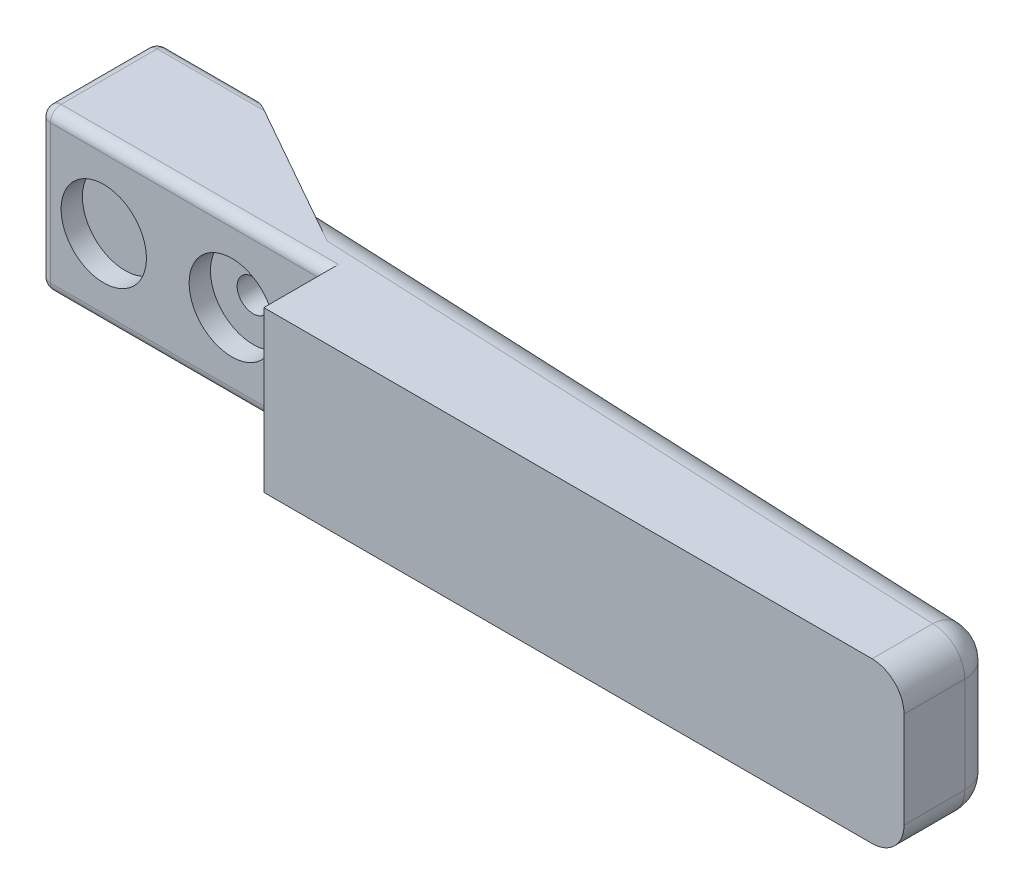
ISO-10303-21;
HEADER;
FILE_DESCRIPTION(('STEP AP214'),'2;1');
FILE_NAME('part.step','',(''),(''),'','','');
FILE_SCHEMA(('AUTOMOTIVE_DESIGN { 1 0 10303 214 1 1 1 1 }'));
ENDSEC;
DATA;
#1=APPLICATION_CONTEXT('core data for automotive mechanical design processes');
#2=APPLICATION_PROTOCOL_DEFINITION('international standard','automotive_design',2000,#1);
#3=PRODUCT_CONTEXT('',#1,'mechanical');
#4=PRODUCT('Part','Part','',(#3));
#5=PRODUCT_RELATED_PRODUCT_CATEGORY('part','',(#4));
#6=PRODUCT_DEFINITION_FORMATION('','',#4);
#7=PRODUCT_DEFINITION_CONTEXT('part definition',#1,'design');
#8=PRODUCT_DEFINITION('design','',#6,#7);
#9=PRODUCT_DEFINITION_SHAPE('','',#8);
#10=(LENGTH_UNIT() NAMED_UNIT(*) SI_UNIT(.MILLI.,.METRE.));
#11=(NAMED_UNIT(*) PLANE_ANGLE_UNIT() SI_UNIT($,.RADIAN.));
#12=(NAMED_UNIT(*) SI_UNIT($,.STERADIAN.) SOLID_ANGLE_UNIT());
#13=UNCERTAINTY_MEASURE_WITH_UNIT(LENGTH_MEASURE(1.E-05),#10,'distance_accuracy_value','');
#14=(GEOMETRIC_REPRESENTATION_CONTEXT(3) GLOBAL_UNCERTAINTY_ASSIGNED_CONTEXT((#13)) GLOBAL_UNIT_ASSIGNED_CONTEXT((#10,
#11,#12)) REPRESENTATION_CONTEXT('',''));
#15=CARTESIAN_POINT('',(0.,0.,0.));
#16=DIRECTION('',(0.,0.,1.));
#17=DIRECTION('',(1.,0.,0.));
#18=AXIS2_PLACEMENT_3D('',#15,#16,#17);
#19=CARTESIAN_POINT('',(110.4563825461,6.08938074333787,-4.));
#20=DIRECTION('',(0.,1.,0.));
#21=DIRECTION('',(0.,0.,1.));
#22=AXIS2_PLACEMENT_3D('',#19,#20,#21);
#23=PLANE('',#22);
#24=DIRECTION('',(0.,0.,-1.));
#25=VECTOR('',#24,1.);
#26=CARTESIAN_POINT('',(110.4563825461,6.08938074333787,-3.));
#27=LINE('',#26,#25);
#28=CARTESIAN_POINT('',(110.4563825461,6.08938074333787,4.));
#29=VERTEX_POINT('',#28);
#30=CARTESIAN_POINT('',(110.4563825461,6.08938074333787,-3.));
#31=VERTEX_POINT('',#30);
#32=EDGE_CURVE('E624',#29,#31,#27,.T.);
#33=ORIENTED_EDGE('',*,*,#32,.T.);
#34=DIRECTION('',(-1.,0.,0.));
#35=VECTOR('',#34,1.);
#36=CARTESIAN_POINT('',(110.4563825461,6.08938074333787,-3.));
#37=LINE('',#36,#35);
#38=CARTESIAN_POINT('',(84.4563825460995,6.08938074333787,-3.));
#39=VERTEX_POINT('',#38);
#40=EDGE_CURVE('E360',#31,#39,#37,.T.);
#41=ORIENTED_EDGE('',*,*,#40,.T.);
#42=DIRECTION('',(0.,0.,1.));
#43=VECTOR('',#42,1.);
#44=CARTESIAN_POINT('',(84.4563825460995,6.08938074333787,-13.));
#45=LINE('',#44,#43);
#46=CARTESIAN_POINT('',(84.4563825460995,6.08938074333787,-12.));
#47=VERTEX_POINT('',#46);
#48=EDGE_CURVE('E357',#39,#47,#45,.F.);
#49=ORIENTED_EDGE('',*,*,#48,.T.);
#50=DIRECTION('',(-1.,0.,0.));
#51=VECTOR('',#50,1.);
#52=CARTESIAN_POINT('',(92.7363825460995,6.08938074333787,-12.));
#53=LINE('',#52,#51);
#54=CARTESIAN_POINT('',(94.5083825460995,6.08938074333787,-12.));
#55=VERTEX_POINT('',#54);
#56=EDGE_CURVE('E363',#47,#55,#53,.F.);
#57=ORIENTED_EDGE('',*,*,#56,.T.);
#58=DIRECTION('',(0.870892170573307,0.,0.491474136892385));
#59=VECTOR('',#58,1.);
#60=CARTESIAN_POINT('',(92.7363825460995,6.08938074333787,-13.));
#61=LINE('',#60,#59);
#62=CARTESIAN_POINT('',(108.008355443351,6.08938074333787,-4.3815051369911));
#63=VERTEX_POINT('',#62);
#64=EDGE_CURVE('E469',#55,#63,#61,.T.);
#65=ORIENTED_EDGE('',*,*,#64,.T.);
#66=DIRECTION('',(-0.998978655607492,0.,-0.0451845730382465));
#67=VECTOR('',#66,1.);
#68=CARTESIAN_POINT('',(170.320828826985,6.08938074333787,-1.56306403317752));
#69=LINE('',#68,#67);
#70=CARTESIAN_POINT('',(167.4563825461,6.08938074333787,-1.69262514188218));
#71=VERTEX_POINT('',#70);
#72=EDGE_CURVE('E281',#63,#71,#69,.F.);
#73=ORIENTED_EDGE('',*,*,#72,.T.);
#74=DIRECTION('',(0.,0.,-1.));
#75=VECTOR('',#74,1.);
#76=CARTESIAN_POINT('',(167.4563825461,6.08938074333787,4.));
#77=LINE('',#76,#75);
#78=CARTESIAN_POINT('',(167.4563825461,6.08938074333787,4.));
#79=VERTEX_POINT('',#78);
#80=EDGE_CURVE('E284',#71,#79,#77,.F.);
#81=ORIENTED_EDGE('',*,*,#80,.T.);
#82=DIRECTION('',(-1.,0.,0.));
#83=VECTOR('',#82,1.);
#84=CARTESIAN_POINT('',(130.4563825461,6.08938074333787,4.));
#85=LINE('',#84,#83);
#86=EDGE_CURVE('E628',#79,#29,#85,.T.);
#87=ORIENTED_EDGE('',*,*,#86,.T.);
#88=EDGE_LOOP('',(#33,#41,#49,#57,#65,#73,#81,#87));
#89=FACE_BOUND('',#88,.T.);
#90=ADVANCED_FACE('F79',(#89),#23,.F.);
#91=CARTESIAN_POINT('',(110.4563825461,21.0893807433379,-4.));
#92=DIRECTION('',(0.,1.,0.));
#93=DIRECTION('',(0.,0.,1.));
#94=AXIS2_PLACEMENT_3D('',#91,#92,#93);
#95=PLANE('',#94);
#96=DIRECTION('',(0.870892170573307,0.,0.491474136892385));
#97=VECTOR('',#96,1.);
#98=CARTESIAN_POINT('',(92.7363825460995,21.0893807433379,-13.));
#99=LINE('',#98,#97);
#100=CARTESIAN_POINT('',(94.5083825460995,21.0893807433379,-12.));
#101=VERTEX_POINT('',#100);
#102=CARTESIAN_POINT('',(108.008355443351,21.0893807433379,-4.3815051369911));
#103=VERTEX_POINT('',#102);
#104=EDGE_CURVE('E480',#101,#103,#99,.T.);
#105=ORIENTED_EDGE('',*,*,#104,.F.);
#106=DIRECTION('',(1.,0.,0.));
#107=VECTOR('',#106,1.);
#108=CARTESIAN_POINT('',(110.4563825461,21.0893807433379,-12.));
#109=LINE('',#108,#107);
#110=CARTESIAN_POINT('',(84.4563825460995,21.0893807433379,-12.));
#111=VERTEX_POINT('',#110);
#112=EDGE_CURVE('E383',#101,#111,#109,.F.);
#113=ORIENTED_EDGE('',*,*,#112,.T.);
#114=DIRECTION('',(0.,0.,1.));
#115=VECTOR('',#114,1.);
#116=CARTESIAN_POINT('',(84.4563825460995,21.0893807433379,-4.));
#117=LINE('',#116,#115);
#118=CARTESIAN_POINT('',(84.4563825460995,21.0893807433379,-3.));
#119=VERTEX_POINT('',#118);
#120=EDGE_CURVE('E380',#111,#119,#117,.T.);
#121=ORIENTED_EDGE('',*,*,#120,.T.);
#122=DIRECTION('',(-1.,0.,0.));
#123=VECTOR('',#122,1.);
#124=CARTESIAN_POINT('',(110.4563825461,21.0893807433379,-3.));
#125=LINE('',#124,#123);
#126=CARTESIAN_POINT('',(110.4563825461,21.0893807433379,-3.));
#127=VERTEX_POINT('',#126);
#128=EDGE_CURVE('E376',#119,#127,#125,.F.);
#129=ORIENTED_EDGE('',*,*,#128,.T.);
#130=DIRECTION('',(0.,0.,1.));
#131=VECTOR('',#130,1.);
#132=CARTESIAN_POINT('',(110.4563825461,21.0893807433379,-3.));
#133=LINE('',#132,#131);
#134=CARTESIAN_POINT('',(110.4563825461,21.0893807433379,4.));
#135=VERTEX_POINT('',#134);
#136=EDGE_CURVE('E244',#127,#135,#133,.T.);
#137=ORIENTED_EDGE('',*,*,#136,.T.);
#138=DIRECTION('',(-1.,0.,0.));
#139=VECTOR('',#138,1.);
#140=CARTESIAN_POINT('',(130.4563825461,21.0893807433379,4.));
#141=LINE('',#140,#139);
#142=CARTESIAN_POINT('',(167.4563825461,21.0893807433379,4.));
#143=VERTEX_POINT('',#142);
#144=EDGE_CURVE('E494',#143,#135,#141,.T.);
#145=ORIENTED_EDGE('',*,*,#144,.F.);
#146=DIRECTION('',(0.,0.,-1.));
#147=VECTOR('',#146,1.);
#148=CARTESIAN_POINT('',(167.4563825461,21.0893807433379,-4.));
#149=LINE('',#148,#147);
#150=CARTESIAN_POINT('',(167.4563825461,21.0893807433379,-1.69262514188218));
#151=VERTEX_POINT('',#150);
#152=EDGE_CURVE('E256',#143,#151,#149,.T.);
#153=ORIENTED_EDGE('',*,*,#152,.T.);
#154=DIRECTION('',(-0.998978655607492,0.,-0.0451845730382465));
#155=VECTOR('',#154,1.);
#156=CARTESIAN_POINT('',(110.468605082879,21.0893807433379,-4.27022615329552));
#157=LINE('',#156,#155);
#158=EDGE_CURVE('E250',#151,#103,#157,.T.);
#159=ORIENTED_EDGE('',*,*,#158,.T.);
#160=EDGE_LOOP('',(#105,#113,#121,#129,#137,#145,#153,#159));
#161=FACE_BOUND('',#160,.T.);
#162=ADVANCED_FACE('F482',(#161),#95,.T.);
#163=CARTESIAN_POINT('',(0.,0.,-13.));
#164=DIRECTION('',(0.,0.,-1.));
#165=DIRECTION('',(-1.,0.,0.));
#166=AXIS2_PLACEMENT_3D('',#163,#164,#165);
#167=PLANE('',#166);
#168=DIRECTION('',(-1.,0.,0.));
#169=VECTOR('',#168,1.);
#170=CARTESIAN_POINT('',(83.4563825460995,7.08938074333787,-13.));
#171=LINE('',#170,#169);
#172=CARTESIAN_POINT('',(92.4736874829512,7.08938074333787,-13.));
#173=VERTEX_POINT('',#172);
#174=CARTESIAN_POINT('',(84.4563825460995,7.08938074333787,-13.));
#175=VERTEX_POINT('',#174);
#176=EDGE_CURVE('E337',#173,#175,#171,.T.);
#177=ORIENTED_EDGE('',*,*,#176,.T.);
#178=DIRECTION('',(0.,1.,0.));
#179=VECTOR('',#178,1.);
#180=CARTESIAN_POINT('',(84.4563825460995,0.,-13.));
#181=LINE('',#180,#179);
#182=CARTESIAN_POINT('',(84.4563825460995,20.0893807433379,-13.));
#183=VERTEX_POINT('',#182);
#184=EDGE_CURVE('E340',#175,#183,#181,.T.);
#185=ORIENTED_EDGE('',*,*,#184,.T.);
#186=DIRECTION('',(1.,0.,0.));
#187=VECTOR('',#186,1.);
#188=CARTESIAN_POINT('',(0.,20.0893807433379,-13.));
#189=LINE('',#188,#187);
#190=CARTESIAN_POINT('',(92.4736874829512,20.0893807433379,-13.));
#191=VERTEX_POINT('',#190);
#192=EDGE_CURVE('E307',#183,#191,#189,.T.);
#193=ORIENTED_EDGE('',*,*,#192,.T.);
#194=DIRECTION('',(0.,-1.,0.));
#195=VECTOR('',#194,1.);
#196=CARTESIAN_POINT('',(92.4736874829512,0.,-13.));
#197=LINE('',#196,#195);
#198=EDGE_CURVE('E334',#191,#173,#197,.T.);
#199=ORIENTED_EDGE('',*,*,#198,.T.);
#200=EDGE_LOOP('',(#177,#185,#193,#199));
#201=FACE_BOUND('',#200,.T.);
#202=ADVANCED_FACE('F543',(#201),#167,.T.);
#203=CARTESIAN_POINT('',(101.4563825461,13.5893807433379,-13.));
#204=DIRECTION('',(0.,0.,1.));
#205=DIRECTION('',(1.,0.,0.));
#206=AXIS2_PLACEMENT_3D('',#203,#204,#205);
#207=CYLINDRICAL_SURFACE('',#206,1.5);
#208=CARTESIAN_POINT('',(101.4563825461,13.5893807433379,-7.5));
#209=DIRECTION('',(0.,0.,-1.));
#210=DIRECTION('',(-1.,0.,0.));
#211=AXIS2_PLACEMENT_3D('',#208,#209,#210);
#212=CIRCLE('',#211,1.5);
#213=CARTESIAN_POINT('',(99.9563825460995,13.5893807433379,-7.5));
#214=VERTEX_POINT('',#213);
#215=EDGE_CURVE('E245',#214,#214,#212,.T.);
#216=ORIENTED_EDGE('',*,*,#215,.T.);
#217=EDGE_LOOP('',(#216));
#218=FACE_BOUND('',#217,.T.);
#219=CARTESIAN_POINT('',(101.4563825461,13.5893807433379,-4.));
#220=DIRECTION('',(0.,0.,-1.));
#221=DIRECTION('',(-1.,0.,0.));
#222=AXIS2_PLACEMENT_3D('',#219,#220,#221);
#223=CIRCLE('',#222,1.5);
#224=CARTESIAN_POINT('',(99.9563825460995,13.5893807433379,-4.));
#225=VERTEX_POINT('',#224);
#226=EDGE_CURVE('E487',#225,#225,#223,.T.);
#227=ORIENTED_EDGE('',*,*,#226,.F.);
#228=EDGE_LOOP('',(#227));
#229=FACE_BOUND('',#228,.T.);
#230=ADVANCED_FACE('F685',(#218,#229),#207,.F.);
#231=CARTESIAN_POINT('',(0.,0.,-2.));
#232=DIRECTION('',(0.,0.,-1.));
#233=DIRECTION('',(-1.,0.,0.));
#234=AXIS2_PLACEMENT_3D('',#231,#232,#233);
#235=PLANE('',#234);
#236=CARTESIAN_POINT('',(101.4563825461,13.5893807433379,-2.));
#237=DIRECTION('',(0.,0.,-1.));
#238=DIRECTION('',(-1.,0.,0.));
#239=AXIS2_PLACEMENT_3D('',#236,#237,#238);
#240=CIRCLE('',#239,4.00000000000001);
#241=CARTESIAN_POINT('',(97.4563825460995,13.5893807433379,-2.));
#242=VERTEX_POINT('',#241);
#243=EDGE_CURVE('E259',#242,#242,#240,.T.);
#244=ORIENTED_EDGE('',*,*,#243,.T.);
#245=EDGE_LOOP('',(#244));
#246=FACE_BOUND('',#245,.T.);
#247=DIRECTION('',(0.,-1.,0.));
#248=VECTOR('',#247,1.);
#249=CARTESIAN_POINT('',(84.4563825460995,6.08938074333787,-2.));
#250=LINE('',#249,#248);
#251=CARTESIAN_POINT('',(84.4563825460995,20.0893807433379,-2.));
#252=VERTEX_POINT('',#251);
#253=CARTESIAN_POINT('',(84.4563825460995,7.08938074333787,-2.));
#254=VERTEX_POINT('',#253);
#255=EDGE_CURVE('E97',#252,#254,#250,.T.);
#256=ORIENTED_EDGE('',*,*,#255,.T.);
#257=DIRECTION('',(-1.,0.,0.));
#258=VECTOR('',#257,1.);
#259=CARTESIAN_POINT('',(0.,7.08938074333787,-2.));
#260=LINE('',#259,#258);
#261=CARTESIAN_POINT('',(110.4563825461,7.08938074333788,-2.));
#262=VERTEX_POINT('',#261);
#263=EDGE_CURVE('E390',#254,#262,#260,.F.);
#264=ORIENTED_EDGE('',*,*,#263,.T.);
#265=DIRECTION('',(0.,-1.,0.));
#266=VECTOR('',#265,1.);
#267=CARTESIAN_POINT('',(110.4563825461,21.0893807433379,-2.));
#268=LINE('',#267,#266);
#269=CARTESIAN_POINT('',(110.4563825461,20.0893807433379,-2.));
#270=VERTEX_POINT('',#269);
#271=EDGE_CURVE('E251',#270,#262,#268,.T.);
#272=ORIENTED_EDGE('',*,*,#271,.F.);
#273=DIRECTION('',(-1.,0.,0.));
#274=VECTOR('',#273,1.);
#275=CARTESIAN_POINT('',(83.4563825460995,20.0893807433379,-2.));
#276=LINE('',#275,#274);
#277=EDGE_CURVE('E102',#270,#252,#276,.T.);
#278=ORIENTED_EDGE('',*,*,#277,.T.);
#279=EDGE_LOOP('',(#256,#264,#272,#278));
#280=FACE_BOUND('',#279,.T.);
#281=CARTESIAN_POINT('',(89.4563825460995,13.5893807433379,-2.));
#282=DIRECTION('',(0.,0.,-1.));
#283=DIRECTION('',(-1.,0.,0.));
#284=AXIS2_PLACEMENT_3D('',#281,#282,#283);
#285=CIRCLE('',#284,4.00000000000001);
#286=CARTESIAN_POINT('',(85.4563825460995,13.5893807433379,-2.));
#287=VERTEX_POINT('',#286);
#288=EDGE_CURVE('E503',#287,#287,#285,.T.);
#289=ORIENTED_EDGE('',*,*,#288,.T.);
#290=EDGE_LOOP('',(#289));
#291=FACE_BOUND('',#290,.T.);
#292=ADVANCED_FACE('F513',(#246,#280,#291),#235,.F.);
#293=CARTESIAN_POINT('',(83.4563825460995,21.0893807433379,-4.));
#294=DIRECTION('',(-1.,0.,0.));
#295=DIRECTION('',(0.,0.,1.));
#296=AXIS2_PLACEMENT_3D('',#293,#294,#295);
#297=PLANE('',#296);
#298=DIRECTION('',(0.,1.,0.));
#299=VECTOR('',#298,1.);
#300=CARTESIAN_POINT('',(83.4563825460995,21.0893807433379,-12.));
#301=LINE('',#300,#299);
#302=CARTESIAN_POINT('',(83.4563825460995,20.0893807433379,-12.));
#303=VERTEX_POINT('',#302);
#304=CARTESIAN_POINT('',(83.4563825460995,7.08938074333787,-12.));
#305=VERTEX_POINT('',#304);
#306=EDGE_CURVE('E350',#303,#305,#301,.F.);
#307=ORIENTED_EDGE('',*,*,#306,.T.);
#308=DIRECTION('',(0.,0.,1.));
#309=VECTOR('',#308,1.);
#310=CARTESIAN_POINT('',(83.4563825460995,7.08938074333787,-2.));
#311=LINE('',#310,#309);
#312=CARTESIAN_POINT('',(83.4563825460995,7.08938074333787,-3.));
#313=VERTEX_POINT('',#312);
#314=EDGE_CURVE('E354',#305,#313,#311,.T.);
#315=ORIENTED_EDGE('',*,*,#314,.T.);
#316=DIRECTION('',(0.,-1.,0.));
#317=VECTOR('',#316,1.);
#318=CARTESIAN_POINT('',(83.4563825460995,21.0893807433379,-3.));
#319=LINE('',#318,#317);
#320=CARTESIAN_POINT('',(83.4563825460995,20.0893807433379,-3.));
#321=VERTEX_POINT('',#320);
#322=EDGE_CURVE('E347',#313,#321,#319,.F.);
#323=ORIENTED_EDGE('',*,*,#322,.T.);
#324=DIRECTION('',(0.,0.,1.));
#325=VECTOR('',#324,1.);
#326=CARTESIAN_POINT('',(83.4563825460995,20.0893807433379,-4.));
#327=LINE('',#326,#325);
#328=EDGE_CURVE('E344',#321,#303,#327,.F.);
#329=ORIENTED_EDGE('',*,*,#328,.T.);
#330=EDGE_LOOP('',(#307,#315,#323,#329));
#331=FACE_BOUND('',#330,.T.);
#332=ADVANCED_FACE('F519',(#331),#297,.T.);
#333=CARTESIAN_POINT('',(101.4563825461,13.5893807433379,-4.));
#334=DIRECTION('',(0.,0.,1.));
#335=DIRECTION('',(1.,0.,0.));
#336=AXIS2_PLACEMENT_3D('',#333,#334,#335);
#337=CYLINDRICAL_SURFACE('',#336,4.00000000000001);
#338=ORIENTED_EDGE('',*,*,#243,.F.);
#339=EDGE_LOOP('',(#338));
#340=FACE_BOUND('',#339,.T.);
#341=CARTESIAN_POINT('',(101.4563825461,13.5893807433379,-4.));
#342=DIRECTION('',(0.,0.,-1.));
#343=DIRECTION('',(-1.,0.,0.));
#344=AXIS2_PLACEMENT_3D('',#341,#342,#343);
#345=CIRCLE('',#344,4.00000000000001);
#346=CARTESIAN_POINT('',(97.4563825460995,13.5893807433379,-4.));
#347=VERTEX_POINT('',#346);
#348=EDGE_CURVE('E502',#347,#347,#345,.T.);
#349=ORIENTED_EDGE('',*,*,#348,.T.);
#350=EDGE_LOOP('',(#349));
#351=FACE_BOUND('',#350,.T.);
#352=ADVANCED_FACE('F515',(#340,#351),#337,.F.);
#353=CARTESIAN_POINT('',(89.4563825460995,13.5893807433379,-4.));
#354=DIRECTION('',(0.,0.,1.));
#355=DIRECTION('',(1.,0.,0.));
#356=AXIS2_PLACEMENT_3D('',#353,#354,#355);
#357=CYLINDRICAL_SURFACE('',#356,4.00000000000001);
#358=CARTESIAN_POINT('',(89.4563825460995,13.5893807433379,-4.));
#359=DIRECTION('',(0.,0.,-1.));
#360=DIRECTION('',(-1.,0.,0.));
#361=AXIS2_PLACEMENT_3D('',#358,#359,#360);
#362=CIRCLE('',#361,4.00000000000001);
#363=CARTESIAN_POINT('',(85.4563825460995,13.5893807433379,-4.));
#364=VERTEX_POINT('',#363);
#365=EDGE_CURVE('E492',#364,#364,#362,.T.);
#366=ORIENTED_EDGE('',*,*,#365,.T.);
#367=EDGE_LOOP('',(#366));
#368=FACE_BOUND('',#367,.T.);
#369=ORIENTED_EDGE('',*,*,#288,.F.);
#370=EDGE_LOOP('',(#369));
#371=FACE_BOUND('',#370,.T.);
#372=ADVANCED_FACE('F518',(#368,#371),#357,.F.);
#373=CARTESIAN_POINT('',(0.,0.,-4.));
#374=DIRECTION('',(0.,0.,-1.));
#375=DIRECTION('',(-1.,0.,0.));
#376=AXIS2_PLACEMENT_3D('',#373,#374,#375);
#377=PLANE('',#376);
#378=ORIENTED_EDGE('',*,*,#365,.F.);
#379=EDGE_LOOP('',(#378));
#380=FACE_BOUND('',#379,.T.);
#381=ADVANCED_FACE('F525',(#380),#377,.F.);
#382=ORIENTED_EDGE('',*,*,#226,.T.);
#383=EDGE_LOOP('',(#382));
#384=FACE_BOUND('',#383,.T.);
#385=ORIENTED_EDGE('',*,*,#348,.F.);
#386=EDGE_LOOP('',(#385));
#387=FACE_BOUND('',#386,.T.);
#388=ADVANCED_FACE('F523',(#384,#387),#377,.F.);
#389=CARTESIAN_POINT('',(92.7363825460995,21.0893807433379,-13.));
#390=DIRECTION('',(0.491474136892385,0.,-0.870892170573306));
#391=DIRECTION('',(-0.870892170573306,0.,-0.491474136892385));
#392=AXIS2_PLACEMENT_3D('',#389,#390,#391);
#393=PLANE('',#392);
#394=ORIENTED_EDGE('',*,*,#64,.F.);
#395=CARTESIAN_POINT('',(94.5083825460995,7.08938074333787,-12.));
#396=DIRECTION('',(0.491474136892385,0.,-0.870892170573306));
#397=DIRECTION('',(0.870892170573307,0.,0.491474136892385));
#398=AXIS2_PLACEMENT_3D('',#395,#396,#397);
#399=ELLIPSE('',#398,2.03469506314828,1.);
#400=CARTESIAN_POINT('',(92.9651616198436,6.5979066064455,-12.8708921705733));
#401=VERTEX_POINT('',#400);
#402=EDGE_CURVE('E373',#55,#401,#399,.T.);
#403=ORIENTED_EDGE('',*,*,#402,.T.);
#404=DIRECTION('',(0.,-1.,0.));
#405=VECTOR('',#404,1.);
#406=CARTESIAN_POINT('',(92.9651616198436,21.0893807433379,-12.8708921705733));
#407=LINE('',#406,#405);
#408=CARTESIAN_POINT('',(92.9651616198436,20.5808548802303,-12.8708921705733));
#409=VERTEX_POINT('',#408);
#410=EDGE_CURVE('E370',#401,#409,#407,.F.);
#411=ORIENTED_EDGE('',*,*,#410,.T.);
#412=CARTESIAN_POINT('',(94.5083825460995,20.0893807433379,-12.));
#413=DIRECTION('',(0.491474136892385,0.,-0.870892170573306));
#414=DIRECTION('',(0.870892170573307,0.,0.491474136892385));
#415=AXIS2_PLACEMENT_3D('',#412,#413,#414);
#416=ELLIPSE('',#415,2.03469506314828,1.);
#417=EDGE_CURVE('E367',#409,#101,#416,.T.);
#418=ORIENTED_EDGE('',*,*,#417,.T.);
#419=ORIENTED_EDGE('',*,*,#104,.T.);
#420=CARTESIAN_POINT('',(108.008355443351,18.0893807433379,-4.3815051369911));
#421=DIRECTION('',(0.491474136892385,0.,-0.870892170573306));
#422=DIRECTION('',(-0.870892170573306,0.,-0.491474136892385));
#423=AXIS2_PLACEMENT_3D('',#420,#421,#422);
#424=ELLIPSE('',#423,6.64273390537929,3.);
#425=CARTESIAN_POINT('',(102.4823825461,18.977195942068,-7.5));
#426=VERTEX_POINT('',#425);
#427=EDGE_CURVE('E301',#103,#426,#424,.F.);
#428=ORIENTED_EDGE('',*,*,#427,.T.);
#429=DIRECTION('',(0.,1.,0.));
#430=VECTOR('',#429,1.);
#431=CARTESIAN_POINT('',(102.4823825461,6.08938074333788,-7.5));
#432=LINE('',#431,#430);
#433=CARTESIAN_POINT('',(102.4823825461,17.4555576663459,-7.5));
#434=VERTEX_POINT('',#433);
#435=EDGE_CURVE('E237',#434,#426,#432,.T.);
#436=ORIENTED_EDGE('',*,*,#435,.F.);
#437=CARTESIAN_POINT('',(101.4563825461,13.5893807433379,-8.07900677200902));
#438=DIRECTION('',(0.491474136892385,0.,-0.870892170573306));
#439=DIRECTION('',(0.870892170573306,0.,0.491474136892385));
#440=AXIS2_PLACEMENT_3D('',#437,#438,#439);
#441=ELLIPSE('',#440,4.59299111320155,4.00000000000001);
#442=CARTESIAN_POINT('',(102.4823825461,9.72320382032982,-7.5));
#443=VERTEX_POINT('',#442);
#444=EDGE_CURVE('E242',#443,#434,#441,.T.);
#445=ORIENTED_EDGE('',*,*,#444,.F.);
#446=CARTESIAN_POINT('',(102.4823825461,8.2015655446078,-7.5));
#447=VERTEX_POINT('',#446);
#448=EDGE_CURVE('E223',#447,#443,#432,.T.);
#449=ORIENTED_EDGE('',*,*,#448,.F.);
#450=CARTESIAN_POINT('',(108.008355443351,9.08938074333788,-4.3815051369911));
#451=DIRECTION('',(0.491474136892385,0.,-0.870892170573306));
#452=DIRECTION('',(0.870892170573306,0.,0.491474136892385));
#453=AXIS2_PLACEMENT_3D('',#450,#451,#452);
#454=ELLIPSE('',#453,6.64273390537929,3.);
#455=EDGE_CURVE('E304',#447,#63,#454,.F.);
#456=ORIENTED_EDGE('',*,*,#455,.T.);
#457=EDGE_LOOP('',(#394,#403,#411,#418,#419,#428,#436,#445,#449,#456));
#458=FACE_BOUND('',#457,.T.);
#459=ADVANCED_FACE('F248',(#458),#393,.T.);
#460=CARTESIAN_POINT('',(101.4563825461,13.5893807433379,-13.));
#461=DIRECTION('',(0.,0.,1.));
#462=DIRECTION('',(1.,0.,0.));
#463=AXIS2_PLACEMENT_3D('',#460,#461,#462);
#464=CYLINDRICAL_SURFACE('',#463,4.00000000000001);
#465=ORIENTED_EDGE('',*,*,#444,.T.);
#466=CARTESIAN_POINT('',(101.4563825461,13.5893807433379,-7.5));
#467=DIRECTION('',(0.,0.,-1.));
#468=DIRECTION('',(-1.,0.,0.));
#469=AXIS2_PLACEMENT_3D('',#466,#467,#468);
#470=CIRCLE('',#469,4.00000000000001);
#471=EDGE_CURVE('E227',#443,#434,#470,.T.);
#472=ORIENTED_EDGE('',*,*,#471,.F.);
#473=EDGE_LOOP('',(#465,#472));
#474=FACE_BOUND('',#473,.T.);
#475=ADVANCED_FACE('F241',(#474),#464,.F.);
#476=CARTESIAN_POINT('',(130.4563825461,21.0893807433379,4.));
#477=DIRECTION('',(0.,0.,-1.));
#478=DIRECTION('',(-1.,0.,0.));
#479=AXIS2_PLACEMENT_3D('',#476,#477,#478);
#480=PLANE('',#479);
#481=DIRECTION('',(0.,1.,0.));
#482=VECTOR('',#481,1.);
#483=CARTESIAN_POINT('',(170.4563825461,6.08938074333788,4.));
#484=LINE('',#483,#482);
#485=CARTESIAN_POINT('',(170.4563825461,9.08938074333788,4.));
#486=VERTEX_POINT('',#485);
#487=CARTESIAN_POINT('',(170.4563825461,18.0893807433379,4.));
#488=VERTEX_POINT('',#487);
#489=EDGE_CURVE('E236',#486,#488,#484,.T.);
#490=ORIENTED_EDGE('',*,*,#489,.T.);
#491=CARTESIAN_POINT('',(167.4563825461,18.0893807433379,4.));
#492=DIRECTION('',(0.,0.,-1.));
#493=DIRECTION('',(-1.,0.,0.));
#494=AXIS2_PLACEMENT_3D('',#491,#492,#493);
#495=CIRCLE('',#494,3.);
#496=EDGE_CURVE('E278',#488,#143,#495,.F.);
#497=ORIENTED_EDGE('',*,*,#496,.T.);
#498=ORIENTED_EDGE('',*,*,#144,.T.);
#499=DIRECTION('',(0.,-1.,0.));
#500=VECTOR('',#499,1.);
#501=CARTESIAN_POINT('',(110.4563825461,21.0893807433379,4.));
#502=LINE('',#501,#500);
#503=EDGE_CURVE('E626',#135,#29,#502,.T.);
#504=ORIENTED_EDGE('',*,*,#503,.T.);
#505=ORIENTED_EDGE('',*,*,#86,.F.);
#506=CARTESIAN_POINT('',(167.4563825461,9.08938074333788,4.));
#507=DIRECTION('',(0.,0.,-1.));
#508=DIRECTION('',(-1.,0.,0.));
#509=AXIS2_PLACEMENT_3D('',#506,#507,#508);
#510=CIRCLE('',#509,3.);
#511=EDGE_CURVE('E275',#79,#486,#510,.F.);
#512=ORIENTED_EDGE('',*,*,#511,.T.);
#513=EDGE_LOOP('',(#490,#497,#498,#504,#505,#512));
#514=FACE_BOUND('',#513,.T.);
#515=ADVANCED_FACE('F633',(#514),#480,.F.);
#516=CARTESIAN_POINT('',(110.4563825461,0.,0.));
#517=DIRECTION('',(-1.,0.,0.));
#518=DIRECTION('',(0.,0.,1.));
#519=AXIS2_PLACEMENT_3D('',#516,#517,#518);
#520=PLANE('',#519);
#521=ORIENTED_EDGE('',*,*,#136,.F.);
#522=CARTESIAN_POINT('',(110.4563825461,20.0893807433379,-3.));
#523=DIRECTION('',(-1.,0.,0.));
#524=DIRECTION('',(0.,0.,1.));
#525=AXIS2_PLACEMENT_3D('',#522,#523,#524);
#526=CIRCLE('',#525,1.);
#527=EDGE_CURVE('E12',#127,#270,#526,.F.);
#528=ORIENTED_EDGE('',*,*,#527,.T.);
#529=ORIENTED_EDGE('',*,*,#271,.T.);
#530=CARTESIAN_POINT('',(110.4563825461,7.08938074333787,-3.));
#531=DIRECTION('',(-1.,0.,0.));
#532=DIRECTION('',(0.,0.,1.));
#533=AXIS2_PLACEMENT_3D('',#530,#531,#532);
#534=CIRCLE('',#533,1.);
#535=EDGE_CURVE('E89',#262,#31,#534,.F.);
#536=ORIENTED_EDGE('',*,*,#535,.T.);
#537=ORIENTED_EDGE('',*,*,#32,.F.);
#538=ORIENTED_EDGE('',*,*,#503,.F.);
#539=EDGE_LOOP('',(#521,#528,#529,#536,#537,#538));
#540=FACE_BOUND('',#539,.T.);
#541=ADVANCED_FACE('F618',(#540),#520,.T.);
#542=CARTESIAN_POINT('',(101.4563825461,13.5893807433379,-7.5));
#543=DIRECTION('',(0.,0.,-1.));
#544=DIRECTION('',(-1.,0.,0.));
#545=AXIS2_PLACEMENT_3D('',#542,#543,#544);
#546=PLANE('',#545);
#547=ORIENTED_EDGE('',*,*,#215,.F.);
#548=EDGE_LOOP('',(#547));
#549=FACE_BOUND('',#548,.T.);
#550=ORIENTED_EDGE('',*,*,#435,.T.);
#551=CARTESIAN_POINT('',(39.0620404448552,18.0893807433379,-7.5));
#552=DIRECTION('',(0.,0.,-1.));
#553=DIRECTION('',(-1.,0.,0.));
#554=AXIS2_PLACEMENT_3D('',#551,#552,#553);
#555=ELLIPSE('',#554,66.3943421012444,3.);
#556=CARTESIAN_POINT('',(105.4563825461,18.0893807433379,-7.5));
#557=VERTEX_POINT('',#556);
#558=EDGE_CURVE('E298',#426,#557,#555,.T.);
#559=ORIENTED_EDGE('',*,*,#558,.T.);
#560=DIRECTION('',(0.,1.,0.));
#561=VECTOR('',#560,1.);
#562=CARTESIAN_POINT('',(105.4563825461,6.08938074333788,-7.5));
#563=LINE('',#562,#561);
#564=CARTESIAN_POINT('',(105.4563825461,9.08938074333788,-7.5));
#565=VERTEX_POINT('',#564);
#566=EDGE_CURVE('E331',#565,#557,#563,.T.);
#567=ORIENTED_EDGE('',*,*,#566,.F.);
#568=CARTESIAN_POINT('',(39.0620404448552,9.08938074333788,-7.5));
#569=DIRECTION('',(0.,0.,-1.));
#570=DIRECTION('',(1.,0.,0.));
#571=AXIS2_PLACEMENT_3D('',#568,#569,#570);
#572=ELLIPSE('',#571,66.3943421012444,3.);
#573=EDGE_CURVE('E230',#565,#447,#572,.T.);
#574=ORIENTED_EDGE('',*,*,#573,.T.);
#575=ORIENTED_EDGE('',*,*,#448,.T.);
#576=ORIENTED_EDGE('',*,*,#471,.T.);
#577=EDGE_LOOP('',(#550,#559,#567,#574,#575,#576));
#578=FACE_BOUND('',#577,.T.);
#579=ADVANCED_FACE('F226',(#549,#578),#546,.T.);
#580=CARTESIAN_POINT('',(170.4563825461,6.08938074333788,-4.56));
#581=DIRECTION('',(1.,0.,0.));
#582=DIRECTION('',(0.,0.,-1.));
#583=AXIS2_PLACEMENT_3D('',#580,#581,#582);
#584=PLANE('',#583);
#585=DIRECTION('',(0.,1.,0.));
#586=VECTOR('',#585,1.);
#587=CARTESIAN_POINT('',(170.4563825461,6.08938074333788,-1.69262514188218));
#588=LINE('',#587,#586);
#589=CARTESIAN_POINT('',(170.4563825461,9.08938074333788,-1.69262514188218));
#590=VERTEX_POINT('',#589);
#591=CARTESIAN_POINT('',(170.4563825461,18.0893807433379,-1.69262514188218));
#592=VERTEX_POINT('',#591);
#593=EDGE_CURVE('E266',#590,#592,#588,.T.);
#594=ORIENTED_EDGE('',*,*,#593,.T.);
#595=DIRECTION('',(0.,0.,-1.));
#596=VECTOR('',#595,1.);
#597=CARTESIAN_POINT('',(170.4563825461,18.0893807433379,-4.56));
#598=LINE('',#597,#596);
#599=EDGE_CURVE('E272',#592,#488,#598,.F.);
#600=ORIENTED_EDGE('',*,*,#599,.T.);
#601=ORIENTED_EDGE('',*,*,#489,.F.);
#602=DIRECTION('',(0.,0.,-1.));
#603=VECTOR('',#602,1.);
#604=CARTESIAN_POINT('',(170.4563825461,9.08938074333788,-4.56));
#605=LINE('',#604,#603);
#606=EDGE_CURVE('E269',#486,#590,#605,.T.);
#607=ORIENTED_EDGE('',*,*,#606,.T.);
#608=EDGE_LOOP('',(#594,#600,#601,#607));
#609=FACE_BOUND('',#608,.T.);
#610=ADVANCED_FACE('F654',(#609),#584,.T.);
#611=CARTESIAN_POINT('',(105.4563825461,6.08938074333788,-7.5));
#612=DIRECTION('',(0.0451845730382465,0.,-0.998978655607492));
#613=DIRECTION('',(-0.998978655607492,0.,-0.0451845730382465));
#614=AXIS2_PLACEMENT_3D('',#611,#612,#613);
#615=PLANE('',#614);
#616=ORIENTED_EDGE('',*,*,#566,.T.);
#617=DIRECTION('',(-0.998978655607492,0.,-0.0451845730382465));
#618=VECTOR('',#617,1.);
#619=CARTESIAN_POINT('',(105.4563825461,18.0893807433379,-7.5));
#620=LINE('',#619,#618);
#621=CARTESIAN_POINT('',(167.591936265214,18.0893807433379,-4.68956110870466));
#622=VERTEX_POINT('',#621);
#623=EDGE_CURVE('E293',#557,#622,#620,.F.);
#624=ORIENTED_EDGE('',*,*,#623,.T.);
#625=DIRECTION('',(0.,1.,0.));
#626=VECTOR('',#625,1.);
#627=CARTESIAN_POINT('',(167.591936265214,6.08938074333788,-4.68956110870466));
#628=LINE('',#627,#626);
#629=CARTESIAN_POINT('',(167.591936265214,9.08938074333788,-4.68956110870466));
#630=VERTEX_POINT('',#629);
#631=EDGE_CURVE('E290',#622,#630,#628,.F.);
#632=ORIENTED_EDGE('',*,*,#631,.T.);
#633=DIRECTION('',(-0.998978655607492,0.,-0.0451845730382465));
#634=VECTOR('',#633,1.);
#635=CARTESIAN_POINT('',(105.4563825461,9.08938074333788,-7.5));
#636=LINE('',#635,#634);
#637=EDGE_CURVE('E287',#630,#565,#636,.T.);
#638=ORIENTED_EDGE('',*,*,#637,.T.);
#639=EDGE_LOOP('',(#616,#624,#632,#638));
#640=FACE_BOUND('',#639,.T.);
#641=ADVANCED_FACE('F573',(#640),#615,.T.);
#642=CARTESIAN_POINT('',(105.320828826985,9.08938074333788,-4.50306403317752));
#643=DIRECTION('',(0.998978655607492,0.,0.0451845730382465));
#644=DIRECTION('',(0.0451845730382465,0.,-0.998978655607492));
#645=AXIS2_PLACEMENT_3D('',#642,#643,#644);
#646=CYLINDRICAL_SURFACE('',#645,3.);
#647=ORIENTED_EDGE('',*,*,#573,.F.);
#648=ORIENTED_EDGE('',*,*,#637,.F.);
#649=CARTESIAN_POINT('',(167.4563825461,9.08938074333788,-1.69262514188218));
#650=DIRECTION('',(0.998978655607492,0.,0.0451845730382502));
#651=DIRECTION('',(0.0451845730382502,0.,-0.998978655607492));
#652=AXIS2_PLACEMENT_3D('',#649,#650,#651);
#653=CIRCLE('',#652,3.);
#654=EDGE_CURVE('E327',#71,#630,#653,.T.);
#655=ORIENTED_EDGE('',*,*,#654,.F.);
#656=ORIENTED_EDGE('',*,*,#72,.F.);
#657=ORIENTED_EDGE('',*,*,#455,.F.);
#658=EDGE_LOOP('',(#647,#648,#655,#656,#657));
#659=FACE_BOUND('',#658,.T.);
#660=ADVANCED_FACE('F569',(#659),#646,.T.);
#661=CARTESIAN_POINT('',(167.4563825461,9.08938074333788,-4.56));
#662=DIRECTION('',(0.,0.,1.));
#663=DIRECTION('',(1.,0.,0.));
#664=AXIS2_PLACEMENT_3D('',#661,#662,#663);
#665=CYLINDRICAL_SURFACE('',#664,3.);
#666=ORIENTED_EDGE('',*,*,#511,.F.);
#667=ORIENTED_EDGE('',*,*,#80,.F.);
#668=CARTESIAN_POINT('',(167.4563825461,9.08938074333788,-1.69262514188218));
#669=DIRECTION('',(0.,0.,-1.));
#670=DIRECTION('',(-1.,0.,0.));
#671=AXIS2_PLACEMENT_3D('',#668,#669,#670);
#672=CIRCLE('',#671,3.);
#673=EDGE_CURVE('E323',#590,#71,#672,.T.);
#674=ORIENTED_EDGE('',*,*,#673,.F.);
#675=ORIENTED_EDGE('',*,*,#606,.F.);
#676=EDGE_LOOP('',(#666,#667,#674,#675));
#677=FACE_BOUND('',#676,.T.);
#678=ADVANCED_FACE('F565',(#677),#665,.T.);
#679=CARTESIAN_POINT('',(167.4563825461,9.08938074333788,-1.69262514188218));
#680=DIRECTION('',(0.,-1.,0.));
#681=DIRECTION('',(0.,0.,-1.));
#682=AXIS2_PLACEMENT_3D('',#679,#680,#681);
#683=SPHERICAL_SURFACE('',#682,3.);
#684=ORIENTED_EDGE('',*,*,#673,.T.);
#685=ORIENTED_EDGE('',*,*,#654,.T.);
#686=CARTESIAN_POINT('',(167.4563825461,9.08938074333788,-1.69262514188218));
#687=DIRECTION('',(0.,-1.,0.));
#688=DIRECTION('',(0.,0.,-1.));
#689=AXIS2_PLACEMENT_3D('',#686,#687,#688);
#690=CIRCLE('',#689,3.);
#691=EDGE_CURVE('E319',#590,#630,#690,.F.);
#692=ORIENTED_EDGE('',*,*,#691,.F.);
#693=EDGE_LOOP('',(#684,#685,#692));
#694=FACE_BOUND('',#693,.T.);
#695=ADVANCED_FACE('F561',(#694),#683,.T.);
#696=CARTESIAN_POINT('',(110.468605082879,18.0893807433379,-4.27022615329552));
#697=DIRECTION('',(-0.998978655607492,0.,-0.0451845730382465));
#698=DIRECTION('',(-0.0451845730382465,0.,0.998978655607492));
#699=AXIS2_PLACEMENT_3D('',#696,#697,#698);
#700=CYLINDRICAL_SURFACE('',#699,3.);
#701=ORIENTED_EDGE('',*,*,#427,.F.);
#702=ORIENTED_EDGE('',*,*,#158,.F.);
#703=CARTESIAN_POINT('',(167.4563825461,18.0893807433379,-1.69262514188218));
#704=DIRECTION('',(0.998978655607491,0.,0.0451845730382501));
#705=DIRECTION('',(0.0451845730382501,0.,-0.998978655607491));
#706=AXIS2_PLACEMENT_3D('',#703,#704,#705);
#707=CIRCLE('',#706,3.);
#708=EDGE_CURVE('E315',#622,#151,#707,.T.);
#709=ORIENTED_EDGE('',*,*,#708,.F.);
#710=ORIENTED_EDGE('',*,*,#623,.F.);
#711=ORIENTED_EDGE('',*,*,#558,.F.);
#712=EDGE_LOOP('',(#701,#702,#709,#710,#711));
#713=FACE_BOUND('',#712,.T.);
#714=ADVANCED_FACE('F557',(#713),#700,.T.);
#715=CARTESIAN_POINT('',(167.4563825461,6.08938074333788,-1.69262514188218));
#716=DIRECTION('',(0.,1.,0.));
#717=DIRECTION('',(0.,0.,1.));
#718=AXIS2_PLACEMENT_3D('',#715,#716,#717);
#719=CYLINDRICAL_SURFACE('',#718,3.);
#720=ORIENTED_EDGE('',*,*,#691,.T.);
#721=ORIENTED_EDGE('',*,*,#631,.F.);
#722=CARTESIAN_POINT('',(167.4563825461,18.0893807433379,-1.69262514188218));
#723=DIRECTION('',(0.,1.,0.));
#724=DIRECTION('',(0.,0.,1.));
#725=AXIS2_PLACEMENT_3D('',#722,#723,#724);
#726=CIRCLE('',#725,3.);
#727=EDGE_CURVE('E311',#592,#622,#726,.T.);
#728=ORIENTED_EDGE('',*,*,#727,.F.);
#729=ORIENTED_EDGE('',*,*,#593,.F.);
#730=EDGE_LOOP('',(#720,#721,#728,#729));
#731=FACE_BOUND('',#730,.T.);
#732=ADVANCED_FACE('F553',(#731),#719,.T.);
#733=CARTESIAN_POINT('',(167.4563825461,18.0893807433379,-1.69262514188218));
#734=DIRECTION('',(0.,1.,0.));
#735=DIRECTION('',(0.,0.,1.));
#736=AXIS2_PLACEMENT_3D('',#733,#734,#735);
#737=SPHERICAL_SURFACE('',#736,3.);
#738=ORIENTED_EDGE('',*,*,#727,.T.);
#739=ORIENTED_EDGE('',*,*,#708,.T.);
#740=CARTESIAN_POINT('',(167.4563825461,18.0893807433379,-1.69262514188218));
#741=DIRECTION('',(0.,0.,-1.));
#742=DIRECTION('',(-1.,0.,0.));
#743=AXIS2_PLACEMENT_3D('',#740,#741,#742);
#744=CIRCLE('',#743,3.);
#745=EDGE_CURVE('E308',#592,#151,#744,.F.);
#746=ORIENTED_EDGE('',*,*,#745,.F.);
#747=EDGE_LOOP('',(#738,#739,#746));
#748=FACE_BOUND('',#747,.T.);
#749=ADVANCED_FACE('F549',(#748),#737,.T.);
#750=CARTESIAN_POINT('',(167.4563825461,18.0893807433379,-4.));
#751=DIRECTION('',(0.,0.,-1.));
#752=DIRECTION('',(-1.,0.,0.));
#753=AXIS2_PLACEMENT_3D('',#750,#751,#752);
#754=CYLINDRICAL_SURFACE('',#753,3.);
#755=ORIENTED_EDGE('',*,*,#496,.F.);
#756=ORIENTED_EDGE('',*,*,#599,.F.);
#757=ORIENTED_EDGE('',*,*,#745,.T.);
#758=ORIENTED_EDGE('',*,*,#152,.F.);
#759=EDGE_LOOP('',(#755,#756,#757,#758));
#760=FACE_BOUND('',#759,.T.);
#761=ADVANCED_FACE('F547',(#760),#754,.T.);
#762=CARTESIAN_POINT('',(110.4563825461,7.08938074333787,-3.));
#763=DIRECTION('',(-1.,0.,0.));
#764=DIRECTION('',(0.,0.,1.));
#765=AXIS2_PLACEMENT_3D('',#762,#763,#764);
#766=CYLINDRICAL_SURFACE('',#765,1.);
#767=ORIENTED_EDGE('',*,*,#535,.F.);
#768=ORIENTED_EDGE('',*,*,#263,.F.);
#769=CARTESIAN_POINT('',(84.4563825460995,7.08938074333787,-3.));
#770=DIRECTION('',(-1.,0.,0.));
#771=DIRECTION('',(0.,0.,1.));
#772=AXIS2_PLACEMENT_3D('',#769,#770,#771);
#773=CIRCLE('',#772,1.);
#774=EDGE_CURVE('E441',#39,#254,#773,.T.);
#775=ORIENTED_EDGE('',*,*,#774,.F.);
#776=ORIENTED_EDGE('',*,*,#40,.F.);
#777=EDGE_LOOP('',(#767,#768,#775,#776));
#778=FACE_BOUND('',#777,.T.);
#779=ADVANCED_FACE('F81',(#778),#766,.T.);
#780=CARTESIAN_POINT('',(0.,20.0893807433379,-3.));
#781=DIRECTION('',(1.,0.,0.));
#782=DIRECTION('',(0.,0.,-1.));
#783=AXIS2_PLACEMENT_3D('',#780,#781,#782);
#784=CYLINDRICAL_SURFACE('',#783,1.);
#785=ORIENTED_EDGE('',*,*,#527,.F.);
#786=ORIENTED_EDGE('',*,*,#128,.F.);
#787=CARTESIAN_POINT('',(84.4563825460995,20.0893807433379,-3.));
#788=DIRECTION('',(-1.,0.,0.));
#789=DIRECTION('',(0.,0.,1.));
#790=AXIS2_PLACEMENT_3D('',#787,#788,#789);
#791=CIRCLE('',#790,1.);
#792=EDGE_CURVE('E438',#252,#119,#791,.T.);
#793=ORIENTED_EDGE('',*,*,#792,.F.);
#794=ORIENTED_EDGE('',*,*,#277,.F.);
#795=EDGE_LOOP('',(#785,#786,#793,#794));
#796=FACE_BOUND('',#795,.T.);
#797=ADVANCED_FACE('F607',(#796),#784,.T.);
#798=CARTESIAN_POINT('',(84.4563825460995,0.,-3.));
#799=DIRECTION('',(0.,1.,0.));
#800=DIRECTION('',(0.,0.,1.));
#801=AXIS2_PLACEMENT_3D('',#798,#799,#800);
#802=CYLINDRICAL_SURFACE('',#801,1.);
#803=CARTESIAN_POINT('',(84.4563825460995,7.08938074333787,-3.));
#804=DIRECTION('',(0.,-1.,0.));
#805=DIRECTION('',(1.,0.,0.));
#806=AXIS2_PLACEMENT_3D('',#803,#804,#805);
#807=CIRCLE('',#806,1.);
#808=EDGE_CURVE('E83',#254,#313,#807,.T.);
#809=ORIENTED_EDGE('',*,*,#808,.F.);
#810=ORIENTED_EDGE('',*,*,#255,.F.);
#811=CARTESIAN_POINT('',(84.4563825460995,20.0893807433379,-3.));
#812=DIRECTION('',(0.,1.,0.));
#813=DIRECTION('',(0.,0.,1.));
#814=AXIS2_PLACEMENT_3D('',#811,#812,#813);
#815=CIRCLE('',#814,1.);
#816=EDGE_CURVE('E434',#321,#252,#815,.T.);
#817=ORIENTED_EDGE('',*,*,#816,.F.);
#818=ORIENTED_EDGE('',*,*,#322,.F.);
#819=EDGE_LOOP('',(#809,#810,#817,#818));
#820=FACE_BOUND('',#819,.T.);
#821=ADVANCED_FACE('F605',(#820),#802,.T.);
#822=CARTESIAN_POINT('',(84.4563825460995,7.08938074333787,-3.));
#823=DIRECTION('',(0.,0.,1.));
#824=DIRECTION('',(1.,0.,0.));
#825=AXIS2_PLACEMENT_3D('',#822,#823,#824);
#826=SPHERICAL_SURFACE('',#825,1.);
#827=ORIENTED_EDGE('',*,*,#774,.T.);
#828=ORIENTED_EDGE('',*,*,#808,.T.);
#829=CARTESIAN_POINT('',(84.4563825460995,7.08938074333787,-3.));
#830=DIRECTION('',(0.,0.,1.));
#831=DIRECTION('',(1.,0.,0.));
#832=AXIS2_PLACEMENT_3D('',#829,#830,#831);
#833=CIRCLE('',#832,1.);
#834=EDGE_CURVE('E430',#39,#313,#833,.F.);
#835=ORIENTED_EDGE('',*,*,#834,.F.);
#836=EDGE_LOOP('',(#827,#828,#835));
#837=FACE_BOUND('',#836,.T.);
#838=ADVANCED_FACE('F450',(#837),#826,.T.);
#839=CARTESIAN_POINT('',(92.4736874829512,0.,-12.));
#840=DIRECTION('',(0.,-1.,0.));
#841=DIRECTION('',(0.,0.,-1.));
#842=AXIS2_PLACEMENT_3D('',#839,#840,#841);
#843=CYLINDRICAL_SURFACE('',#842,1.);
#844=CARTESIAN_POINT('',(92.4736874829512,20.0893807433379,-12.));
#845=DIRECTION('',(0.707106781186547,-0.707106781186547,0.));
#846=DIRECTION('',(0.707106781186547,0.707106781186547,0.));
#847=AXIS2_PLACEMENT_3D('',#844,#845,#846);
#848=ELLIPSE('',#847,1.41421356237309,1.);
#849=EDGE_CURVE('E422',#409,#191,#848,.F.);
#850=ORIENTED_EDGE('',*,*,#849,.F.);
#851=ORIENTED_EDGE('',*,*,#410,.F.);
#852=CARTESIAN_POINT('',(92.4736874829512,7.08938074333787,-12.));
#853=DIRECTION('',(-0.707106781186547,-0.707106781186547,0.));
#854=DIRECTION('',(0.707106781186547,-0.707106781186547,0.));
#855=AXIS2_PLACEMENT_3D('',#852,#853,#854);
#856=ELLIPSE('',#855,1.41421356237309,1.);
#857=EDGE_CURVE('E426',#173,#401,#856,.T.);
#858=ORIENTED_EDGE('',*,*,#857,.F.);
#859=ORIENTED_EDGE('',*,*,#198,.F.);
#860=EDGE_LOOP('',(#850,#851,#858,#859));
#861=FACE_BOUND('',#860,.T.);
#862=ADVANCED_FACE('F471',(#861),#843,.T.);
#863=CARTESIAN_POINT('',(84.4563825460995,20.0893807433379,-3.));
#864=DIRECTION('',(0.,0.,1.));
#865=DIRECTION('',(1.,0.,0.));
#866=AXIS2_PLACEMENT_3D('',#863,#864,#865);
#867=SPHERICAL_SURFACE('',#866,1.);
#868=ORIENTED_EDGE('',*,*,#816,.T.);
#869=ORIENTED_EDGE('',*,*,#792,.T.);
#870=CARTESIAN_POINT('',(84.4563825460995,20.0893807433379,-3.));
#871=DIRECTION('',(0.,0.,1.));
#872=DIRECTION('',(1.,0.,0.));
#873=AXIS2_PLACEMENT_3D('',#870,#871,#872);
#874=CIRCLE('',#873,1.);
#875=EDGE_CURVE('E418',#321,#119,#874,.F.);
#876=ORIENTED_EDGE('',*,*,#875,.F.);
#877=EDGE_LOOP('',(#868,#869,#876));
#878=FACE_BOUND('',#877,.T.);
#879=ADVANCED_FACE('F597',(#878),#867,.T.);
#880=CARTESIAN_POINT('',(84.4563825460995,7.08938074333787,-4.));
#881=DIRECTION('',(0.,0.,-1.));
#882=DIRECTION('',(-1.,0.,0.));
#883=AXIS2_PLACEMENT_3D('',#880,#881,#882);
#884=CYLINDRICAL_SURFACE('',#883,1.);
#885=ORIENTED_EDGE('',*,*,#834,.T.);
#886=ORIENTED_EDGE('',*,*,#314,.F.);
#887=CARTESIAN_POINT('',(84.4563825460995,7.08938074333787,-12.));
#888=DIRECTION('',(0.,0.,-1.));
#889=DIRECTION('',(-1.,0.,0.));
#890=AXIS2_PLACEMENT_3D('',#887,#888,#889);
#891=CIRCLE('',#890,1.);
#892=EDGE_CURVE('E414',#47,#305,#891,.T.);
#893=ORIENTED_EDGE('',*,*,#892,.F.);
#894=ORIENTED_EDGE('',*,*,#48,.F.);
#895=EDGE_LOOP('',(#885,#886,#893,#894));
#896=FACE_BOUND('',#895,.T.);
#897=ADVANCED_FACE('F456',(#896),#884,.T.);
#898=CARTESIAN_POINT('',(0.,7.08938074333787,-12.));
#899=DIRECTION('',(1.,0.,0.));
#900=DIRECTION('',(0.,0.,-1.));
#901=AXIS2_PLACEMENT_3D('',#898,#899,#900);
#902=CYLINDRICAL_SURFACE('',#901,1.);
#903=ORIENTED_EDGE('',*,*,#402,.F.);
#904=ORIENTED_EDGE('',*,*,#56,.F.);
#905=CARTESIAN_POINT('',(84.4563825460995,7.08938074333787,-12.));
#906=DIRECTION('',(-1.,0.,0.));
#907=DIRECTION('',(0.,0.,1.));
#908=AXIS2_PLACEMENT_3D('',#905,#906,#907);
#909=CIRCLE('',#908,1.);
#910=EDGE_CURVE('E410',#175,#47,#909,.T.);
#911=ORIENTED_EDGE('',*,*,#910,.F.);
#912=ORIENTED_EDGE('',*,*,#176,.F.);
#913=ORIENTED_EDGE('',*,*,#857,.T.);
#914=EDGE_LOOP('',(#903,#904,#911,#912,#913));
#915=FACE_BOUND('',#914,.T.);
#916=ADVANCED_FACE('F463',(#915),#902,.T.);
#917=CARTESIAN_POINT('',(0.,20.0893807433379,-12.));
#918=DIRECTION('',(1.,0.,0.));
#919=DIRECTION('',(0.,0.,-1.));
#920=AXIS2_PLACEMENT_3D('',#917,#918,#919);
#921=CYLINDRICAL_SURFACE('',#920,1.);
#922=ORIENTED_EDGE('',*,*,#849,.T.);
#923=ORIENTED_EDGE('',*,*,#192,.F.);
#924=CARTESIAN_POINT('',(84.4563825460995,20.0893807433379,-12.));
#925=DIRECTION('',(-1.,0.,0.));
#926=DIRECTION('',(0.,0.,1.));
#927=AXIS2_PLACEMENT_3D('',#924,#925,#926);
#928=CIRCLE('',#927,1.);
#929=EDGE_CURVE('E406',#111,#183,#928,.T.);
#930=ORIENTED_EDGE('',*,*,#929,.F.);
#931=ORIENTED_EDGE('',*,*,#112,.F.);
#932=ORIENTED_EDGE('',*,*,#417,.F.);
#933=EDGE_LOOP('',(#922,#923,#930,#931,#932));
#934=FACE_BOUND('',#933,.T.);
#935=ADVANCED_FACE('F477',(#934),#921,.T.);
#936=CARTESIAN_POINT('',(84.4563825460995,20.0893807433379,-4.));
#937=DIRECTION('',(0.,0.,1.));
#938=DIRECTION('',(1.,0.,0.));
#939=AXIS2_PLACEMENT_3D('',#936,#937,#938);
#940=CYLINDRICAL_SURFACE('',#939,1.);
#941=ORIENTED_EDGE('',*,*,#875,.T.);
#942=ORIENTED_EDGE('',*,*,#120,.F.);
#943=CARTESIAN_POINT('',(84.4563825460995,20.0893807433379,-12.));
#944=DIRECTION('',(0.,0.,-1.));
#945=DIRECTION('',(-1.,0.,0.));
#946=AXIS2_PLACEMENT_3D('',#943,#944,#945);
#947=CIRCLE('',#946,1.);
#948=EDGE_CURVE('E402',#303,#111,#947,.T.);
#949=ORIENTED_EDGE('',*,*,#948,.F.);
#950=ORIENTED_EDGE('',*,*,#328,.F.);
#951=EDGE_LOOP('',(#941,#942,#949,#950));
#952=FACE_BOUND('',#951,.T.);
#953=ADVANCED_FACE('F586',(#952),#940,.T.);
#954=CARTESIAN_POINT('',(84.4563825460995,7.08938074333787,-12.));
#955=DIRECTION('',(0.,-1.,0.));
#956=DIRECTION('',(0.,0.,-1.));
#957=AXIS2_PLACEMENT_3D('',#954,#955,#956);
#958=SPHERICAL_SURFACE('',#957,1.);
#959=ORIENTED_EDGE('',*,*,#910,.T.);
#960=ORIENTED_EDGE('',*,*,#892,.T.);
#961=CARTESIAN_POINT('',(84.4563825460995,7.08938074333787,-12.));
#962=DIRECTION('',(0.,-1.,0.));
#963=DIRECTION('',(0.,0.,-1.));
#964=AXIS2_PLACEMENT_3D('',#961,#962,#963);
#965=CIRCLE('',#964,1.);
#966=EDGE_CURVE('E399',#175,#305,#965,.F.);
#967=ORIENTED_EDGE('',*,*,#966,.F.);
#968=EDGE_LOOP('',(#959,#960,#967));
#969=FACE_BOUND('',#968,.T.);
#970=ADVANCED_FACE('F582',(#969),#958,.T.);
#971=CARTESIAN_POINT('',(84.4563825460995,20.0893807433379,-12.));
#972=DIRECTION('',(0.,1.,0.));
#973=DIRECTION('',(0.,0.,1.));
#974=AXIS2_PLACEMENT_3D('',#971,#972,#973);
#975=SPHERICAL_SURFACE('',#974,1.);
#976=ORIENTED_EDGE('',*,*,#948,.T.);
#977=ORIENTED_EDGE('',*,*,#929,.T.);
#978=CARTESIAN_POINT('',(84.4563825460995,20.0893807433379,-12.));
#979=DIRECTION('',(0.,1.,0.));
#980=DIRECTION('',(0.,0.,1.));
#981=AXIS2_PLACEMENT_3D('',#978,#979,#980);
#982=CIRCLE('',#981,1.);
#983=EDGE_CURVE('E396',#303,#183,#982,.F.);
#984=ORIENTED_EDGE('',*,*,#983,.F.);
#985=EDGE_LOOP('',(#976,#977,#984));
#986=FACE_BOUND('',#985,.T.);
#987=ADVANCED_FACE('F578',(#986),#975,.T.);
#988=CARTESIAN_POINT('',(84.4563825460995,0.,-12.));
#989=DIRECTION('',(0.,1.,0.));
#990=DIRECTION('',(0.,0.,1.));
#991=AXIS2_PLACEMENT_3D('',#988,#989,#990);
#992=CYLINDRICAL_SURFACE('',#991,1.);
#993=ORIENTED_EDGE('',*,*,#966,.T.);
#994=ORIENTED_EDGE('',*,*,#306,.F.);
#995=ORIENTED_EDGE('',*,*,#983,.T.);
#996=ORIENTED_EDGE('',*,*,#184,.F.);
#997=EDGE_LOOP('',(#993,#994,#995,#996));
#998=FACE_BOUND('',#997,.T.);
#999=ADVANCED_FACE('F575',(#998),#992,.T.);
#1000=CLOSED_SHELL('',(#90,#162,#202,#230,#292,#332,#352,#372,#381,#388,#459,#475,#515,#541,
#579,#610,#641,#660,#678,#695,#714,#732,#749,#761,#779,#797,#821,#838,#862,#879,#897,#916,#935,
#953,#970,#987,#999));
#1001=MANIFOLD_SOLID_BREP('B2',#1000);
#1002=ADVANCED_BREP_SHAPE_REPRESENTATION('',(#18,#1001),#14);
#1003=SHAPE_DEFINITION_REPRESENTATION(#9,#1002);
ENDSEC;
END-ISO-10303-21;
